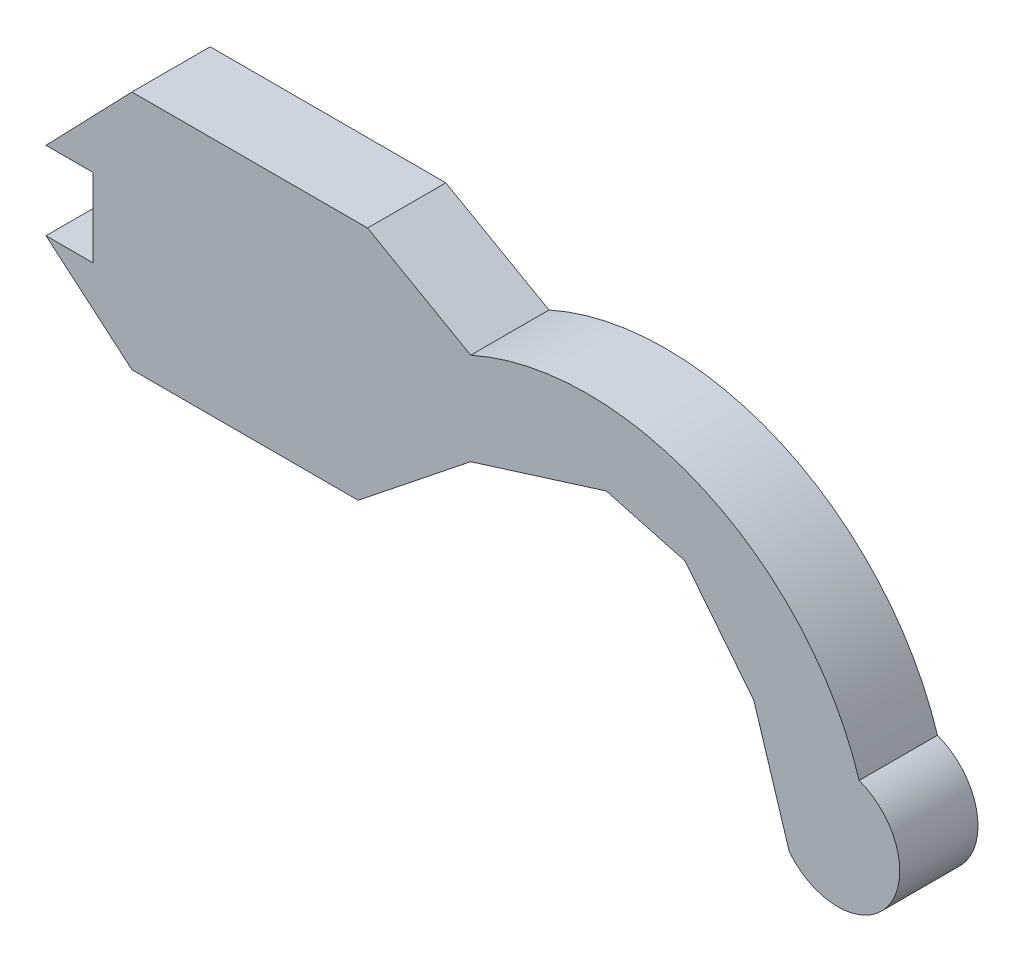
ISO-10303-21;
HEADER;
FILE_DESCRIPTION(('STEP AP214'),'2;1');
FILE_NAME('part.step','',(''),(''),'','','');
FILE_SCHEMA(('AUTOMOTIVE_DESIGN { 1 0 10303 214 1 1 1 1 }'));
ENDSEC;
DATA;
#1=APPLICATION_CONTEXT('core data for automotive mechanical design processes');
#2=APPLICATION_PROTOCOL_DEFINITION('international standard','automotive_design',2000,#1);
#3=PRODUCT_CONTEXT('',#1,'mechanical');
#4=PRODUCT('Part','Part','',(#3));
#5=PRODUCT_RELATED_PRODUCT_CATEGORY('part','',(#4));
#6=PRODUCT_DEFINITION_FORMATION('','',#4);
#7=PRODUCT_DEFINITION_CONTEXT('part definition',#1,'design');
#8=PRODUCT_DEFINITION('design','',#6,#7);
#9=PRODUCT_DEFINITION_SHAPE('','',#8);
#10=(LENGTH_UNIT() NAMED_UNIT(*) SI_UNIT(.MILLI.,.METRE.));
#11=(NAMED_UNIT(*) PLANE_ANGLE_UNIT() SI_UNIT($,.RADIAN.));
#12=(NAMED_UNIT(*) SI_UNIT($,.STERADIAN.) SOLID_ANGLE_UNIT());
#13=UNCERTAINTY_MEASURE_WITH_UNIT(LENGTH_MEASURE(1.E-05),#10,'distance_accuracy_value','');
#14=(GEOMETRIC_REPRESENTATION_CONTEXT(3) GLOBAL_UNCERTAINTY_ASSIGNED_CONTEXT((#13)) GLOBAL_UNIT_ASSIGNED_CONTEXT((#10,
#11,#12)) REPRESENTATION_CONTEXT('',''));
#15=CARTESIAN_POINT('',(0.,0.,0.));
#16=DIRECTION('',(0.,0.,1.));
#17=DIRECTION('',(1.,0.,0.));
#18=AXIS2_PLACEMENT_3D('',#15,#16,#17);
#19=CARTESIAN_POINT('',(8.88089615466651,0.,1.524));
#20=DIRECTION('',(1.,0.,0.));
#21=DIRECTION('',(0.,1.,0.));
#22=AXIS2_PLACEMENT_3D('',#19,#20,#21);
#23=PLANE('',#22);
#24=DIRECTION('',(0.,-1.,0.));
#25=VECTOR('',#24,1.);
#26=CARTESIAN_POINT('',(8.88089615466651,0.,0.));
#27=LINE('',#26,#25);
#28=CARTESIAN_POINT('',(8.8808961546665,1.524,0.));
#29=VERTEX_POINT('',#28);
#30=CARTESIAN_POINT('',(8.88089615466651,0.,0.));
#31=VERTEX_POINT('',#30);
#32=EDGE_CURVE('E170',#29,#31,#27,.T.);
#33=ORIENTED_EDGE('',*,*,#32,.T.);
#34=DIRECTION('',(0.,0.,-1.));
#35=VECTOR('',#34,1.);
#36=CARTESIAN_POINT('',(8.88089615466651,0.,1.524));
#37=LINE('',#36,#35);
#38=CARTESIAN_POINT('',(8.88089615466651,0.,1.524));
#39=VERTEX_POINT('',#38);
#40=EDGE_CURVE('E11',#39,#31,#37,.T.);
#41=ORIENTED_EDGE('',*,*,#40,.F.);
#42=DIRECTION('',(0.,-1.,0.));
#43=VECTOR('',#42,1.);
#44=CARTESIAN_POINT('',(8.88089615466651,0.,1.524));
#45=LINE('',#44,#43);
#46=CARTESIAN_POINT('',(8.8808961546665,1.524,1.524));
#47=VERTEX_POINT('',#46);
#48=EDGE_CURVE('E198',#47,#39,#45,.T.);
#49=ORIENTED_EDGE('',*,*,#48,.F.);
#50=DIRECTION('',(0.,0.,-1.));
#51=VECTOR('',#50,1.);
#52=CARTESIAN_POINT('',(8.8808961546665,1.524,1.524));
#53=LINE('',#52,#51);
#54=EDGE_CURVE('E166',#47,#29,#53,.T.);
#55=ORIENTED_EDGE('',*,*,#54,.T.);
#56=EDGE_LOOP('',(#33,#41,#49,#55));
#57=FACE_BOUND('',#56,.T.);
#58=ADVANCED_FACE('F32',(#57),#23,.F.);
#59=CARTESIAN_POINT('',(8.88089615466651,0.,1.524));
#60=DIRECTION('',(0.,-1.,0.));
#61=DIRECTION('',(1.,0.,0.));
#62=AXIS2_PLACEMENT_3D('',#59,#60,#61);
#63=PLANE('',#62);
#64=DIRECTION('',(-1.,0.,0.));
#65=VECTOR('',#64,1.);
#66=CARTESIAN_POINT('',(8.88089615466651,0.,0.));
#67=LINE('',#66,#65);
#68=CARTESIAN_POINT('',(7.96275520650624,0.,0.));
#69=VERTEX_POINT('',#68);
#70=EDGE_CURVE('E173',#31,#69,#67,.T.);
#71=ORIENTED_EDGE('',*,*,#70,.T.);
#72=DIRECTION('',(0.,0.,-1.));
#73=VECTOR('',#72,1.);
#74=CARTESIAN_POINT('',(7.96275520650624,0.,1.524));
#75=LINE('',#74,#73);
#76=CARTESIAN_POINT('',(7.96275520650624,0.,1.524));
#77=VERTEX_POINT('',#76);
#78=EDGE_CURVE('E40',#77,#69,#75,.T.);
#79=ORIENTED_EDGE('',*,*,#78,.F.);
#80=DIRECTION('',(-1.,0.,0.));
#81=VECTOR('',#80,1.);
#82=CARTESIAN_POINT('',(8.88089615466651,0.,1.524));
#83=LINE('',#82,#81);
#84=EDGE_CURVE('E112',#39,#77,#83,.T.);
#85=ORIENTED_EDGE('',*,*,#84,.F.);
#86=ORIENTED_EDGE('',*,*,#40,.T.);
#87=EDGE_LOOP('',(#71,#79,#85,#86));
#88=FACE_BOUND('',#87,.T.);
#89=ADVANCED_FACE('F291',(#88),#63,.F.);
#90=CARTESIAN_POINT('',(7.96275520650624,0.,1.524));
#91=DIRECTION('',(0.647927752595678,0.761701796910256,0.));
#92=DIRECTION('',(-0.761701796910256,0.647927752595678,0.));
#93=AXIS2_PLACEMENT_3D('',#90,#91,#92);
#94=PLANE('',#93);
#95=DIRECTION('',(0.761701796910256,-0.647927752595678,0.));
#96=VECTOR('',#95,1.);
#97=CARTESIAN_POINT('',(7.96275520650624,0.,0.));
#98=LINE('',#97,#96);
#99=CARTESIAN_POINT('',(9.63526495880274,-1.42268994164851,0.));
#100=VERTEX_POINT('',#99);
#101=EDGE_CURVE('E175',#69,#100,#98,.T.);
#102=ORIENTED_EDGE('',*,*,#101,.T.);
#103=DIRECTION('',(0.,0.,-1.));
#104=VECTOR('',#103,1.);
#105=CARTESIAN_POINT('',(9.63526495880274,-1.42268994164851,1.524));
#106=LINE('',#105,#104);
#107=CARTESIAN_POINT('',(9.63526495880274,-1.42268994164851,1.524));
#108=VERTEX_POINT('',#107);
#109=EDGE_CURVE('E226',#108,#100,#106,.T.);
#110=ORIENTED_EDGE('',*,*,#109,.F.);
#111=DIRECTION('',(0.761701796910256,-0.647927752595678,0.));
#112=VECTOR('',#111,1.);
#113=CARTESIAN_POINT('',(7.96275520650624,0.,1.524));
#114=LINE('',#113,#112);
#115=EDGE_CURVE('E234',#77,#108,#114,.T.);
#116=ORIENTED_EDGE('',*,*,#115,.F.);
#117=ORIENTED_EDGE('',*,*,#78,.T.);
#118=EDGE_LOOP('',(#102,#110,#116,#117));
#119=FACE_BOUND('',#118,.T.);
#120=ADVANCED_FACE('F232',(#119),#94,.F.);
#121=CARTESIAN_POINT('',(9.63526495880274,-1.42268994164851,1.524));
#122=DIRECTION('',(0.,1.,0.));
#123=DIRECTION('',(0.,0.,1.));
#124=AXIS2_PLACEMENT_3D('',#121,#122,#123);
#125=PLANE('',#124);
#126=DIRECTION('',(1.,0.,0.));
#127=VECTOR('',#126,1.);
#128=CARTESIAN_POINT('',(9.63526495880274,-1.42268994164851,0.));
#129=LINE('',#128,#127);
#130=CARTESIAN_POINT('',(14.0399740443268,-1.42268994164851,0.));
#131=VERTEX_POINT('',#130);
#132=EDGE_CURVE('E177',#100,#131,#129,.T.);
#133=ORIENTED_EDGE('',*,*,#132,.T.);
#134=DIRECTION('',(0.,0.,-1.));
#135=VECTOR('',#134,1.);
#136=CARTESIAN_POINT('',(14.0399740443268,-1.42268994164851,1.524));
#137=LINE('',#136,#135);
#138=CARTESIAN_POINT('',(14.0399740443268,-1.42268994164851,1.524));
#139=VERTEX_POINT('',#138);
#140=EDGE_CURVE('E223',#139,#131,#137,.T.);
#141=ORIENTED_EDGE('',*,*,#140,.F.);
#142=DIRECTION('',(1.,0.,0.));
#143=VECTOR('',#142,1.);
#144=CARTESIAN_POINT('',(9.63526495880274,-1.42268994164851,1.524));
#145=LINE('',#144,#143);
#146=EDGE_CURVE('E252',#108,#139,#145,.T.);
#147=ORIENTED_EDGE('',*,*,#146,.F.);
#148=ORIENTED_EDGE('',*,*,#109,.T.);
#149=EDGE_LOOP('',(#133,#141,#147,#148));
#150=FACE_BOUND('',#149,.T.);
#151=ADVANCED_FACE('F243',(#150),#125,.F.);
#152=CARTESIAN_POINT('',(14.0399740443268,-1.42268994164851,1.524));
#153=DIRECTION('',(-0.623248971299542,0.782023477763975,0.));
#154=DIRECTION('',(-0.782023477763975,-0.623248971299542,0.));
#155=AXIS2_PLACEMENT_3D('',#152,#153,#154);
#156=PLANE('',#155);
#157=DIRECTION('',(0.782023477763975,0.623248971299542,0.));
#158=VECTOR('',#157,1.);
#159=CARTESIAN_POINT('',(14.0399740443268,-1.42268994164851,0.));
#160=LINE('',#159,#158);
#161=CARTESIAN_POINT('',(16.2315547756862,0.323933369770657,0.));
#162=VERTEX_POINT('',#161);
#163=EDGE_CURVE('E179',#131,#162,#160,.T.);
#164=ORIENTED_EDGE('',*,*,#163,.T.);
#165=DIRECTION('',(0.,0.,-1.));
#166=VECTOR('',#165,1.);
#167=CARTESIAN_POINT('',(16.2315547756862,0.323933369770657,1.524));
#168=LINE('',#167,#166);
#169=CARTESIAN_POINT('',(16.2315547756862,0.323933369770657,1.524));
#170=VERTEX_POINT('',#169);
#171=EDGE_CURVE('E220',#170,#162,#168,.T.);
#172=ORIENTED_EDGE('',*,*,#171,.F.);
#173=DIRECTION('',(0.782023477763975,0.623248971299542,0.));
#174=VECTOR('',#173,1.);
#175=CARTESIAN_POINT('',(14.0399740443268,-1.42268994164851,1.524));
#176=LINE('',#175,#174);
#177=EDGE_CURVE('E249',#139,#170,#176,.T.);
#178=ORIENTED_EDGE('',*,*,#177,.F.);
#179=ORIENTED_EDGE('',*,*,#140,.T.);
#180=EDGE_LOOP('',(#164,#172,#178,#179));
#181=FACE_BOUND('',#180,.T.);
#182=ADVANCED_FACE('F247',(#181),#156,.F.);
#183=CARTESIAN_POINT('',(16.2315547756862,0.323933369770657,1.524));
#184=DIRECTION('',(-0.29845530407199,0.95442361217192,0.));
#185=DIRECTION('',(-0.95442361217192,-0.29845530407199,0.));
#186=AXIS2_PLACEMENT_3D('',#183,#184,#185);
#187=PLANE('',#186);
#188=DIRECTION('',(0.95442361217192,0.29845530407199,0.));
#189=VECTOR('',#188,1.);
#190=CARTESIAN_POINT('',(16.2315547756862,0.323933369770657,0.));
#191=LINE('',#190,#189);
#192=CARTESIAN_POINT('',(18.8727560660027,1.14985649673827,0.));
#193=VERTEX_POINT('',#192);
#194=EDGE_CURVE('E181',#162,#193,#191,.T.);
#195=ORIENTED_EDGE('',*,*,#194,.T.);
#196=DIRECTION('',(0.,0.,-1.));
#197=VECTOR('',#196,1.);
#198=CARTESIAN_POINT('',(18.8727560660027,1.14985649673827,1.524));
#199=LINE('',#198,#197);
#200=CARTESIAN_POINT('',(18.8727560660027,1.14985649673827,1.524));
#201=VERTEX_POINT('',#200);
#202=EDGE_CURVE('E217',#201,#193,#199,.T.);
#203=ORIENTED_EDGE('',*,*,#202,.F.);
#204=DIRECTION('',(0.95442361217192,0.29845530407199,0.));
#205=VECTOR('',#204,1.);
#206=CARTESIAN_POINT('',(16.2315547756862,0.323933369770657,1.524));
#207=LINE('',#206,#205);
#208=EDGE_CURVE('E251',#170,#201,#207,.T.);
#209=ORIENTED_EDGE('',*,*,#208,.F.);
#210=ORIENTED_EDGE('',*,*,#171,.T.);
#211=EDGE_LOOP('',(#195,#203,#209,#210));
#212=FACE_BOUND('',#211,.T.);
#213=ADVANCED_FACE('F304',(#212),#187,.F.);
#214=CARTESIAN_POINT('',(18.8727560660027,1.14985649673827,1.524));
#215=DIRECTION('',(0.26028531339664,0.965531747603368,0.));
#216=DIRECTION('',(-0.965531747603368,0.26028531339664,0.));
#217=AXIS2_PLACEMENT_3D('',#214,#215,#216);
#218=PLANE('',#217);
#219=DIRECTION('',(0.965531747603367,-0.26028531339664,0.));
#220=VECTOR('',#219,1.);
#221=CARTESIAN_POINT('',(18.8727560660027,1.14985649673827,0.));
#222=LINE('',#221,#220);
#223=CARTESIAN_POINT('',(20.4046423444879,0.736894933254462,0.));
#224=VERTEX_POINT('',#223);
#225=EDGE_CURVE('E183',#193,#224,#222,.T.);
#226=ORIENTED_EDGE('',*,*,#225,.T.);
#227=DIRECTION('',(0.,0.,-1.));
#228=VECTOR('',#227,1.);
#229=CARTESIAN_POINT('',(20.4046423444879,0.736894933254462,1.524));
#230=LINE('',#229,#228);
#231=CARTESIAN_POINT('',(20.4046423444879,0.736894933254462,1.524));
#232=VERTEX_POINT('',#231);
#233=EDGE_CURVE('E214',#232,#224,#230,.T.);
#234=ORIENTED_EDGE('',*,*,#233,.F.);
#235=DIRECTION('',(0.965531747603367,-0.26028531339664,0.));
#236=VECTOR('',#235,1.);
#237=CARTESIAN_POINT('',(18.8727560660027,1.14985649673827,1.524));
#238=LINE('',#237,#236);
#239=EDGE_CURVE('E254',#201,#232,#238,.T.);
#240=ORIENTED_EDGE('',*,*,#239,.F.);
#241=ORIENTED_EDGE('',*,*,#202,.T.);
#242=EDGE_LOOP('',(#226,#234,#240,#241));
#243=FACE_BOUND('',#242,.T.);
#244=ADVANCED_FACE('F307',(#243),#218,.F.);
#245=CARTESIAN_POINT('',(20.4046423444879,0.736894933254462,1.524));
#246=DIRECTION('',(0.782023477763975,0.623248971299542,0.));
#247=DIRECTION('',(-0.623248971299542,0.782023477763975,0.));
#248=AXIS2_PLACEMENT_3D('',#245,#246,#247);
#249=PLANE('',#248);
#250=DIRECTION('',(0.623248971299542,-0.782023477763975,0.));
#251=VECTOR('',#250,1.);
#252=CARTESIAN_POINT('',(20.4046423444879,0.736894933254462,0.));
#253=LINE('',#252,#251);
#254=CARTESIAN_POINT('',(21.7445487743551,-0.944356596095357,0.));
#255=VERTEX_POINT('',#254);
#256=EDGE_CURVE('E185',#224,#255,#253,.T.);
#257=ORIENTED_EDGE('',*,*,#256,.T.);
#258=DIRECTION('',(0.,0.,-1.));
#259=VECTOR('',#258,1.);
#260=CARTESIAN_POINT('',(21.7445487743551,-0.944356596095357,1.524));
#261=LINE('',#260,#259);
#262=CARTESIAN_POINT('',(21.7445487743551,-0.944356596095357,1.524));
#263=VERTEX_POINT('',#262);
#264=EDGE_CURVE('E211',#263,#255,#261,.T.);
#265=ORIENTED_EDGE('',*,*,#264,.F.);
#266=DIRECTION('',(0.623248971299542,-0.782023477763975,0.));
#267=VECTOR('',#266,1.);
#268=CARTESIAN_POINT('',(20.4046423444879,0.736894933254462,1.524));
#269=LINE('',#268,#267);
#270=EDGE_CURVE('E260',#232,#263,#269,.T.);
#271=ORIENTED_EDGE('',*,*,#270,.F.);
#272=ORIENTED_EDGE('',*,*,#233,.T.);
#273=EDGE_LOOP('',(#257,#265,#271,#272));
#274=FACE_BOUND('',#273,.T.);
#275=ADVANCED_FACE('F311',(#274),#249,.F.);
#276=CARTESIAN_POINT('',(21.7445487743551,-0.944356596095357,1.524));
#277=DIRECTION('',(0.95442361217192,0.29845530407199,0.));
#278=DIRECTION('',(-0.29845530407199,0.95442361217192,0.));
#279=AXIS2_PLACEMENT_3D('',#276,#277,#278);
#280=PLANE('',#279);
#281=DIRECTION('',(0.29845530407199,-0.95442361217192,0.));
#282=VECTOR('',#281,1.);
#283=CARTESIAN_POINT('',(21.7445487743551,-0.944356596095357,0.));
#284=LINE('',#283,#282);
#285=CARTESIAN_POINT('',(22.4353466441029,-3.15344381662717,0.));
#286=VERTEX_POINT('',#285);
#287=EDGE_CURVE('E187',#255,#286,#284,.T.);
#288=ORIENTED_EDGE('',*,*,#287,.T.);
#289=DIRECTION('',(0.,0.,-1.));
#290=VECTOR('',#289,1.);
#291=CARTESIAN_POINT('',(22.4353466441029,-3.15344381662717,1.524));
#292=LINE('',#291,#290);
#293=CARTESIAN_POINT('',(22.4353466441029,-3.15344381662717,1.524));
#294=VERTEX_POINT('',#293);
#295=EDGE_CURVE('E208',#294,#286,#292,.T.);
#296=ORIENTED_EDGE('',*,*,#295,.F.);
#297=DIRECTION('',(0.29845530407199,-0.95442361217192,0.));
#298=VECTOR('',#297,1.);
#299=CARTESIAN_POINT('',(21.7445487743551,-0.944356596095357,1.524));
#300=LINE('',#299,#298);
#301=EDGE_CURVE('E262',#263,#294,#300,.T.);
#302=ORIENTED_EDGE('',*,*,#301,.F.);
#303=ORIENTED_EDGE('',*,*,#264,.T.);
#304=EDGE_LOOP('',(#288,#296,#302,#303));
#305=FACE_BOUND('',#304,.T.);
#306=ADVANCED_FACE('F315',(#305),#280,.F.);
#307=CARTESIAN_POINT('',(23.3782866443061,-2.40110054277062,1.524));
#308=DIRECTION('',(0.,0.,-1.));
#309=DIRECTION('',(-1.,0.,0.));
#310=AXIS2_PLACEMENT_3D('',#307,#308,#309);
#311=CYLINDRICAL_SURFACE('',#310,1.20629857236935);
#312=CARTESIAN_POINT('',(23.3782866443061,-2.40110054277062,0.));
#313=DIRECTION('',(0.,0.,1.));
#314=DIRECTION('',(-1.,0.,0.));
#315=AXIS2_PLACEMENT_3D('',#312,#313,#314);
#316=CIRCLE('',#315,1.20629857236935);
#317=CARTESIAN_POINT('',(23.7951643222232,-1.26912472705953,0.));
#318=VERTEX_POINT('',#317);
#319=EDGE_CURVE('E189',#286,#318,#316,.T.);
#320=ORIENTED_EDGE('',*,*,#319,.T.);
#321=DIRECTION('',(0.,0.,-1.));
#322=VECTOR('',#321,1.);
#323=CARTESIAN_POINT('',(23.7951643222232,-1.26912472705953,1.524));
#324=LINE('',#323,#322);
#325=CARTESIAN_POINT('',(23.7951643222232,-1.26912472705953,1.524));
#326=VERTEX_POINT('',#325);
#327=EDGE_CURVE('E205',#326,#318,#324,.T.);
#328=ORIENTED_EDGE('',*,*,#327,.F.);
#329=CARTESIAN_POINT('',(23.3782866443061,-2.40110054277062,1.524));
#330=DIRECTION('',(0.,0.,1.));
#331=DIRECTION('',(-1.,0.,0.));
#332=AXIS2_PLACEMENT_3D('',#329,#330,#331);
#333=CIRCLE('',#332,1.20629857236935);
#334=EDGE_CURVE('E264',#294,#326,#333,.T.);
#335=ORIENTED_EDGE('',*,*,#334,.F.);
#336=ORIENTED_EDGE('',*,*,#295,.T.);
#337=EDGE_LOOP('',(#320,#328,#335,#336));
#338=FACE_BOUND('',#337,.T.);
#339=ADVANCED_FACE('F319',(#338),#311,.T.);
#340=CARTESIAN_POINT('',(18.5056781084217,-2.93925757092401,1.524));
#341=DIRECTION('',(0.,0.,-1.));
#342=DIRECTION('',(-1.,0.,0.));
#343=AXIS2_PLACEMENT_3D('',#340,#341,#342);
#344=CYLINDRICAL_SURFACE('',#343,5.54689175323901);
#345=CARTESIAN_POINT('',(18.5056781084217,-2.93925757092401,0.));
#346=DIRECTION('',(0.,0.,1.));
#347=DIRECTION('',(-1.,0.,0.));
#348=AXIS2_PLACEMENT_3D('',#345,#346,#347);
#349=CIRCLE('',#348,5.54689175323901);
#350=CARTESIAN_POINT('',(16.2315547756862,2.12002806932787,0.));
#351=VERTEX_POINT('',#350);
#352=EDGE_CURVE('E191',#318,#351,#349,.T.);
#353=ORIENTED_EDGE('',*,*,#352,.T.);
#354=DIRECTION('',(0.,0.,-1.));
#355=VECTOR('',#354,1.);
#356=CARTESIAN_POINT('',(16.2315547756862,2.12002806932787,1.524));
#357=LINE('',#356,#355);
#358=CARTESIAN_POINT('',(16.2315547756862,2.12002806932787,1.524));
#359=VERTEX_POINT('',#358);
#360=EDGE_CURVE('E202',#359,#351,#357,.T.);
#361=ORIENTED_EDGE('',*,*,#360,.F.);
#362=CARTESIAN_POINT('',(18.5056781084217,-2.93925757092401,1.524));
#363=DIRECTION('',(0.,0.,1.));
#364=DIRECTION('',(-1.,0.,0.));
#365=AXIS2_PLACEMENT_3D('',#362,#363,#364);
#366=CIRCLE('',#365,5.54689175323901);
#367=EDGE_CURVE('E266',#326,#359,#366,.T.);
#368=ORIENTED_EDGE('',*,*,#367,.F.);
#369=ORIENTED_EDGE('',*,*,#327,.T.);
#370=EDGE_LOOP('',(#353,#361,#368,#369));
#371=FACE_BOUND('',#370,.T.);
#372=ADVANCED_FACE('F272',(#371),#344,.T.);
#373=CARTESIAN_POINT('',(14.2232102667776,3.26007969829334,1.524));
#374=DIRECTION('',(-0.493664609127265,-0.869652375202428,0.));
#375=DIRECTION('',(0.869652375202428,-0.493664609127265,0.));
#376=AXIS2_PLACEMENT_3D('',#373,#374,#375);
#377=PLANE('',#376);
#378=DIRECTION('',(-0.869652375202428,0.493664609127265,0.));
#379=VECTOR('',#378,1.);
#380=CARTESIAN_POINT('',(14.2232102667776,3.26007969829334,0.));
#381=LINE('',#380,#379);
#382=CARTESIAN_POINT('',(14.2232102667776,3.26007969829334,0.));
#383=VERTEX_POINT('',#382);
#384=EDGE_CURVE('E193',#351,#383,#381,.T.);
#385=ORIENTED_EDGE('',*,*,#384,.T.);
#386=DIRECTION('',(0.,0.,-1.));
#387=VECTOR('',#386,1.);
#388=CARTESIAN_POINT('',(14.2232102667776,3.26007969829334,1.524));
#389=LINE('',#388,#387);
#390=CARTESIAN_POINT('',(14.2232102667776,3.26007969829334,1.524));
#391=VERTEX_POINT('',#390);
#392=EDGE_CURVE('E161',#391,#383,#389,.T.);
#393=ORIENTED_EDGE('',*,*,#392,.F.);
#394=DIRECTION('',(-0.869652375202428,0.493664609127265,0.));
#395=VECTOR('',#394,1.);
#396=CARTESIAN_POINT('',(14.2232102667776,3.26007969829334,1.524));
#397=LINE('',#396,#395);
#398=EDGE_CURVE('E152',#359,#391,#397,.T.);
#399=ORIENTED_EDGE('',*,*,#398,.F.);
#400=ORIENTED_EDGE('',*,*,#360,.T.);
#401=EDGE_LOOP('',(#385,#393,#399,#400));
#402=FACE_BOUND('',#401,.T.);
#403=ADVANCED_FACE('F276',(#402),#377,.F.);
#404=CARTESIAN_POINT('',(9.63526495880274,3.26007969829334,1.524));
#405=DIRECTION('',(0.,-1.,0.));
#406=DIRECTION('',(0.,0.,-1.));
#407=AXIS2_PLACEMENT_3D('',#404,#405,#406);
#408=PLANE('',#407);
#409=DIRECTION('',(-1.,0.,0.));
#410=VECTOR('',#409,1.);
#411=CARTESIAN_POINT('',(9.63526495880274,3.26007969829334,0.));
#412=LINE('',#411,#410);
#413=CARTESIAN_POINT('',(9.63526495880274,3.26007969829334,0.));
#414=VERTEX_POINT('',#413);
#415=EDGE_CURVE('E160',#383,#414,#412,.T.);
#416=ORIENTED_EDGE('',*,*,#415,.T.);
#417=DIRECTION('',(0.,0.,-1.));
#418=VECTOR('',#417,1.);
#419=CARTESIAN_POINT('',(9.63526495880274,3.26007969829334,1.524));
#420=LINE('',#419,#418);
#421=CARTESIAN_POINT('',(9.63526495880274,3.26007969829334,1.524));
#422=VERTEX_POINT('',#421);
#423=EDGE_CURVE('E157',#422,#414,#420,.T.);
#424=ORIENTED_EDGE('',*,*,#423,.F.);
#425=DIRECTION('',(-1.,0.,0.));
#426=VECTOR('',#425,1.);
#427=CARTESIAN_POINT('',(9.63526495880274,3.26007969829334,1.524));
#428=LINE('',#427,#426);
#429=EDGE_CURVE('E146',#391,#422,#428,.T.);
#430=ORIENTED_EDGE('',*,*,#429,.F.);
#431=ORIENTED_EDGE('',*,*,#392,.T.);
#432=EDGE_LOOP('',(#416,#424,#430,#431));
#433=FACE_BOUND('',#432,.T.);
#434=ADVANCED_FACE('F158',(#433),#408,.F.);
#435=CARTESIAN_POINT('',(7.96275520650624,1.524,1.524));
#436=DIRECTION('',(0.720169037728113,-0.693798643049814,0.));
#437=DIRECTION('',(0.693798643049814,0.720169037728113,0.));
#438=AXIS2_PLACEMENT_3D('',#435,#436,#437);
#439=PLANE('',#438);
#440=DIRECTION('',(-0.693798643049814,-0.720169037728113,0.));
#441=VECTOR('',#440,1.);
#442=CARTESIAN_POINT('',(7.96275520650624,1.524,0.));
#443=LINE('',#442,#441);
#444=CARTESIAN_POINT('',(7.96275520650624,1.524,0.));
#445=VERTEX_POINT('',#444);
#446=EDGE_CURVE('E98',#414,#445,#443,.T.);
#447=ORIENTED_EDGE('',*,*,#446,.T.);
#448=DIRECTION('',(0.,0.,-1.));
#449=VECTOR('',#448,1.);
#450=CARTESIAN_POINT('',(7.96275520650624,1.524,1.524));
#451=LINE('',#450,#449);
#452=CARTESIAN_POINT('',(7.96275520650624,1.524,1.524));
#453=VERTEX_POINT('',#452);
#454=EDGE_CURVE('E162',#453,#445,#451,.T.);
#455=ORIENTED_EDGE('',*,*,#454,.F.);
#456=DIRECTION('',(-0.693798643049814,-0.720169037728113,0.));
#457=VECTOR('',#456,1.);
#458=CARTESIAN_POINT('',(7.96275520650624,1.524,1.524));
#459=LINE('',#458,#457);
#460=EDGE_CURVE('E150',#422,#453,#459,.T.);
#461=ORIENTED_EDGE('',*,*,#460,.F.);
#462=ORIENTED_EDGE('',*,*,#423,.T.);
#463=EDGE_LOOP('',(#447,#455,#461,#462));
#464=FACE_BOUND('',#463,.T.);
#465=ADVANCED_FACE('F164',(#464),#439,.F.);
#466=CARTESIAN_POINT('',(8.8808961546665,1.524,1.524));
#467=DIRECTION('',(0.,1.,0.));
#468=DIRECTION('',(0.,0.,1.));
#469=AXIS2_PLACEMENT_3D('',#466,#467,#468);
#470=PLANE('',#469);
#471=DIRECTION('',(1.,0.,0.));
#472=VECTOR('',#471,1.);
#473=CARTESIAN_POINT('',(8.8808961546665,1.524,0.));
#474=LINE('',#473,#472);
#475=EDGE_CURVE('E104',#445,#29,#474,.T.);
#476=ORIENTED_EDGE('',*,*,#475,.T.);
#477=ORIENTED_EDGE('',*,*,#54,.F.);
#478=DIRECTION('',(1.,0.,0.));
#479=VECTOR('',#478,1.);
#480=CARTESIAN_POINT('',(8.8808961546665,1.524,1.524));
#481=LINE('',#480,#479);
#482=EDGE_CURVE('E48',#453,#47,#481,.T.);
#483=ORIENTED_EDGE('',*,*,#482,.F.);
#484=ORIENTED_EDGE('',*,*,#454,.T.);
#485=EDGE_LOOP('',(#476,#477,#483,#484));
#486=FACE_BOUND('',#485,.T.);
#487=ADVANCED_FACE('F280',(#486),#470,.F.);
#488=CARTESIAN_POINT('',(18.5056781084217,-2.93925757092401,1.524));
#489=DIRECTION('',(0.,0.,-1.));
#490=DIRECTION('',(-1.,0.,0.));
#491=AXIS2_PLACEMENT_3D('',#488,#489,#490);
#492=PLANE('',#491);
#493=ORIENTED_EDGE('',*,*,#48,.T.);
#494=ORIENTED_EDGE('',*,*,#84,.T.);
#495=ORIENTED_EDGE('',*,*,#115,.T.);
#496=ORIENTED_EDGE('',*,*,#146,.T.);
#497=ORIENTED_EDGE('',*,*,#177,.T.);
#498=ORIENTED_EDGE('',*,*,#208,.T.);
#499=ORIENTED_EDGE('',*,*,#239,.T.);
#500=ORIENTED_EDGE('',*,*,#270,.T.);
#501=ORIENTED_EDGE('',*,*,#301,.T.);
#502=ORIENTED_EDGE('',*,*,#334,.T.);
#503=ORIENTED_EDGE('',*,*,#367,.T.);
#504=ORIENTED_EDGE('',*,*,#398,.T.);
#505=ORIENTED_EDGE('',*,*,#429,.T.);
#506=ORIENTED_EDGE('',*,*,#460,.T.);
#507=ORIENTED_EDGE('',*,*,#482,.T.);
#508=EDGE_LOOP('',(#493,#494,#495,#496,#497,#498,#499,#500,#501,#502,#503,#504,#505,#506,#507));
#509=FACE_BOUND('',#508,.T.);
#510=ADVANCED_FACE('F148',(#509),#492,.F.);
#511=CARTESIAN_POINT('',(18.5056781084217,-2.93925757092401,0.));
#512=DIRECTION('',(0.,0.,-1.));
#513=DIRECTION('',(-1.,0.,0.));
#514=AXIS2_PLACEMENT_3D('',#511,#512,#513);
#515=PLANE('',#514);
#516=ORIENTED_EDGE('',*,*,#32,.F.);
#517=ORIENTED_EDGE('',*,*,#475,.F.);
#518=ORIENTED_EDGE('',*,*,#446,.F.);
#519=ORIENTED_EDGE('',*,*,#415,.F.);
#520=ORIENTED_EDGE('',*,*,#384,.F.);
#521=ORIENTED_EDGE('',*,*,#352,.F.);
#522=ORIENTED_EDGE('',*,*,#319,.F.);
#523=ORIENTED_EDGE('',*,*,#287,.F.);
#524=ORIENTED_EDGE('',*,*,#256,.F.);
#525=ORIENTED_EDGE('',*,*,#225,.F.);
#526=ORIENTED_EDGE('',*,*,#194,.F.);
#527=ORIENTED_EDGE('',*,*,#163,.F.);
#528=ORIENTED_EDGE('',*,*,#132,.F.);
#529=ORIENTED_EDGE('',*,*,#101,.F.);
#530=ORIENTED_EDGE('',*,*,#70,.F.);
#531=EDGE_LOOP('',(#516,#517,#518,#519,#520,#521,#522,#523,#524,#525,#526,#527,#528,#529,#530));
#532=FACE_BOUND('',#531,.T.);
#533=ADVANCED_FACE('F238',(#532),#515,.T.);
#534=CLOSED_SHELL('',(#58,#89,#120,#151,#182,#213,#244,#275,#306,#339,#372,#403,#434,#465,#487,
#510,#533));
#535=MANIFOLD_SOLID_BREP('B2',#534);
#536=ADVANCED_BREP_SHAPE_REPRESENTATION('',(#18,#535),#14);
#537=SHAPE_DEFINITION_REPRESENTATION(#9,#536);
ENDSEC;
END-ISO-10303-21;
